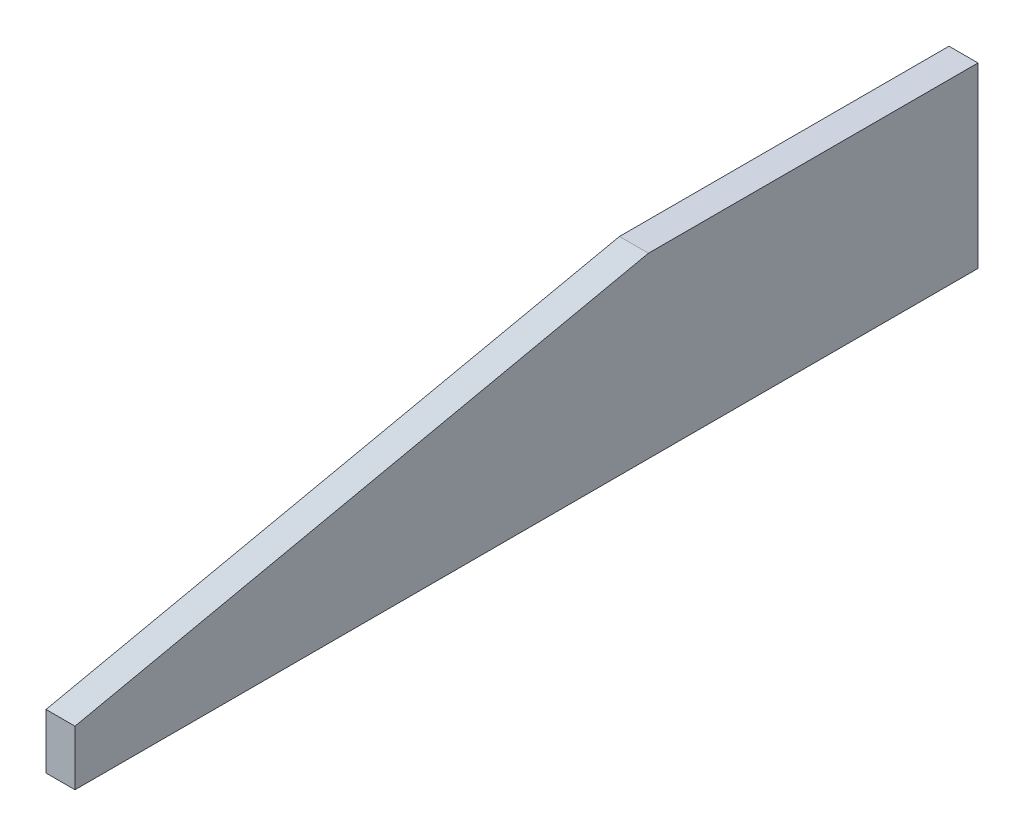
ISO-10303-21;
HEADER;
FILE_DESCRIPTION(('STEP AP214'),'2;1');
FILE_NAME('part.step','',(''),(''),'','','');
FILE_SCHEMA(('AUTOMOTIVE_DESIGN { 1 0 10303 214 1 1 1 1 }'));
ENDSEC;
DATA;
#1=APPLICATION_CONTEXT('core data for automotive mechanical design processes');
#2=APPLICATION_PROTOCOL_DEFINITION('international standard','automotive_design',2000,#1);
#3=PRODUCT_CONTEXT('',#1,'mechanical');
#4=PRODUCT('Part','Part','',(#3));
#5=PRODUCT_RELATED_PRODUCT_CATEGORY('part','',(#4));
#6=PRODUCT_DEFINITION_FORMATION('','',#4);
#7=PRODUCT_DEFINITION_CONTEXT('part definition',#1,'design');
#8=PRODUCT_DEFINITION('design','',#6,#7);
#9=PRODUCT_DEFINITION_SHAPE('','',#8);
#10=(LENGTH_UNIT() NAMED_UNIT(*) SI_UNIT(.MILLI.,.METRE.));
#11=(NAMED_UNIT(*) PLANE_ANGLE_UNIT() SI_UNIT($,.RADIAN.));
#12=(NAMED_UNIT(*) SI_UNIT($,.STERADIAN.) SOLID_ANGLE_UNIT());
#13=UNCERTAINTY_MEASURE_WITH_UNIT(LENGTH_MEASURE(1.E-05),#10,'distance_accuracy_value','');
#14=(GEOMETRIC_REPRESENTATION_CONTEXT(3) GLOBAL_UNCERTAINTY_ASSIGNED_CONTEXT((#13)) GLOBAL_UNIT_ASSIGNED_CONTEXT((#10,
#11,#12)) REPRESENTATION_CONTEXT('',''));
#15=CARTESIAN_POINT('',(0.,0.,0.));
#16=DIRECTION('',(0.,0.,1.));
#17=DIRECTION('',(1.,0.,0.));
#18=AXIS2_PLACEMENT_3D('',#15,#16,#17);
#19=CARTESIAN_POINT('',(-22.01,205.,100.01));
#20=DIRECTION('',(0.,1.,0.));
#21=DIRECTION('',(1.,0.,0.));
#22=AXIS2_PLACEMENT_3D('',#19,#20,#21);
#23=PLANE('',#22);
#24=DIRECTION('',(0.,0.,1.));
#25=VECTOR('',#24,1.);
#26=CARTESIAN_POINT('',(0.,205.,192.5));
#27=LINE('',#26,#25);
#28=CARTESIAN_POINT('',(0.,205.,-150.));
#29=VERTEX_POINT('',#28);
#30=CARTESIAN_POINT('',(0.,205.,100.));
#31=VERTEX_POINT('',#30);
#32=EDGE_CURVE('E61',#29,#31,#27,.T.);
#33=ORIENTED_EDGE('',*,*,#32,.F.);
#34=DIRECTION('',(1.,0.,0.));
#35=VECTOR('',#34,1.);
#36=CARTESIAN_POINT('',(-11.,205.,-150.));
#37=LINE('',#36,#35);
#38=CARTESIAN_POINT('',(-22.,205.,-150.));
#39=VERTEX_POINT('',#38);
#40=EDGE_CURVE('E64',#39,#29,#37,.T.);
#41=ORIENTED_EDGE('',*,*,#40,.F.);
#42=DIRECTION('',(0.,0.,-1.));
#43=VECTOR('',#42,1.);
#44=CARTESIAN_POINT('',(-22.,205.,192.5));
#45=LINE('',#44,#43);
#46=CARTESIAN_POINT('',(-22.,205.,99.9999999999995));
#47=VERTEX_POINT('',#46);
#48=EDGE_CURVE('E95',#47,#39,#45,.T.);
#49=ORIENTED_EDGE('',*,*,#48,.F.);
#50=DIRECTION('',(-1.,0.,0.));
#51=VECTOR('',#50,1.);
#52=CARTESIAN_POINT('',(-11.,205.,99.9999999999999));
#53=LINE('',#52,#51);
#54=EDGE_CURVE('E67',#31,#47,#53,.T.);
#55=ORIENTED_EDGE('',*,*,#54,.F.);
#56=EDGE_LOOP('',(#33,#41,#49,#55));
#57=FACE_BOUND('',#56,.T.);
#58=ADVANCED_FACE('F17',(#57),#23,.T.);
#59=CARTESIAN_POINT('',(0.01,69.9899999999998,-150.));
#60=DIRECTION('',(0.,0.,-1.));
#61=DIRECTION('',(-1.,0.,0.));
#62=AXIS2_PLACEMENT_3D('',#59,#60,#61);
#63=PLANE('',#62);
#64=DIRECTION('',(0.,-1.,0.));
#65=VECTOR('',#64,1.);
#66=CARTESIAN_POINT('',(-22.,137.5,-150.));
#67=LINE('',#66,#65);
#68=CARTESIAN_POINT('',(-22.,69.9999999999998,-150.));
#69=VERTEX_POINT('',#68);
#70=EDGE_CURVE('E77',#39,#69,#67,.T.);
#71=ORIENTED_EDGE('',*,*,#70,.F.);
#72=ORIENTED_EDGE('',*,*,#40,.T.);
#73=DIRECTION('',(0.,1.,0.));
#74=VECTOR('',#73,1.);
#75=CARTESIAN_POINT('',(0.,137.5,-150.));
#76=LINE('',#75,#74);
#77=CARTESIAN_POINT('',(0.,69.9999999999999,-150.));
#78=VERTEX_POINT('',#77);
#79=EDGE_CURVE('E71',#78,#29,#76,.T.);
#80=ORIENTED_EDGE('',*,*,#79,.F.);
#81=DIRECTION('',(1.,0.,0.));
#82=VECTOR('',#81,1.);
#83=CARTESIAN_POINT('',(-11.,69.9999999999998,-150.));
#84=LINE('',#83,#82);
#85=EDGE_CURVE('E103',#69,#78,#84,.T.);
#86=ORIENTED_EDGE('',*,*,#85,.F.);
#87=EDGE_LOOP('',(#71,#72,#80,#86));
#88=FACE_BOUND('',#87,.T.);
#89=ADVANCED_FACE('F74',(#88),#63,.T.);
#90=CARTESIAN_POINT('',(0.,205.01,535.01));
#91=DIRECTION('',(1.,0.,0.));
#92=DIRECTION('',(0.,-1.,0.));
#93=AXIS2_PLACEMENT_3D('',#90,#91,#92);
#94=PLANE('',#93);
#95=DIRECTION('',(0.,0.,1.));
#96=VECTOR('',#95,1.);
#97=CARTESIAN_POINT('',(0.,69.9999999999998,192.5));
#98=LINE('',#97,#96);
#99=CARTESIAN_POINT('',(0.,69.9999999999999,535.));
#100=VERTEX_POINT('',#99);
#101=EDGE_CURVE('E82',#78,#100,#98,.T.);
#102=ORIENTED_EDGE('',*,*,#101,.F.);
#103=ORIENTED_EDGE('',*,*,#79,.T.);
#104=ORIENTED_EDGE('',*,*,#32,.T.);
#105=DIRECTION('',(0.,0.209529088730872,-0.97780241407741));
#106=VECTOR('',#105,1.);
#107=CARTESIAN_POINT('',(0.,158.392857142857,317.5));
#108=LINE('',#107,#106);
#109=CARTESIAN_POINT('',(0.,111.785714285714,535.));
#110=VERTEX_POINT('',#109);
#111=EDGE_CURVE('E84',#110,#31,#108,.T.);
#112=ORIENTED_EDGE('',*,*,#111,.F.);
#113=DIRECTION('',(0.,1.,0.));
#114=VECTOR('',#113,1.);
#115=CARTESIAN_POINT('',(0.,90.892857142857,535.));
#116=LINE('',#115,#114);
#117=EDGE_CURVE('E94',#100,#110,#116,.T.);
#118=ORIENTED_EDGE('',*,*,#117,.F.);
#119=EDGE_LOOP('',(#102,#103,#104,#112,#118));
#120=FACE_BOUND('',#119,.T.);
#121=ADVANCED_FACE('F80',(#120),#94,.T.);
#122=CARTESIAN_POINT('',(0.01,111.783618994827,535.009778024141));
#123=DIRECTION('',(0.,0.97780241407741,0.209529088730872));
#124=DIRECTION('',(0.,0.209529088730872,-0.97780241407741));
#125=AXIS2_PLACEMENT_3D('',#122,#123,#124);
#126=PLANE('',#125);
#127=DIRECTION('',(0.,0.209529088730874,-0.977802414077409));
#128=VECTOR('',#127,1.);
#129=CARTESIAN_POINT('',(-22.,111.785714285714,535.));
#130=LINE('',#129,#128);
#131=CARTESIAN_POINT('',(-22.,111.785714285714,535.));
#132=VERTEX_POINT('',#131);
#133=EDGE_CURVE('E21',#132,#47,#130,.T.);
#134=ORIENTED_EDGE('',*,*,#133,.F.);
#135=DIRECTION('',(-1.,0.,0.));
#136=VECTOR('',#135,1.);
#137=CARTESIAN_POINT('',(-11.,111.785714285714,535.));
#138=LINE('',#137,#136);
#139=EDGE_CURVE('E91',#110,#132,#138,.T.);
#140=ORIENTED_EDGE('',*,*,#139,.F.);
#141=ORIENTED_EDGE('',*,*,#111,.T.);
#142=ORIENTED_EDGE('',*,*,#54,.T.);
#143=EDGE_LOOP('',(#134,#140,#141,#142));
#144=FACE_BOUND('',#143,.T.);
#145=ADVANCED_FACE('F100',(#144),#126,.T.);
#146=CARTESIAN_POINT('',(-22.,69.9899999999998,535.01));
#147=DIRECTION('',(-1.,0.,0.));
#148=DIRECTION('',(0.,1.,0.));
#149=AXIS2_PLACEMENT_3D('',#146,#147,#148);
#150=PLANE('',#149);
#151=ORIENTED_EDGE('',*,*,#48,.T.);
#152=ORIENTED_EDGE('',*,*,#70,.T.);
#153=DIRECTION('',(0.,0.,-1.));
#154=VECTOR('',#153,1.);
#155=CARTESIAN_POINT('',(-22.,69.9999999999998,192.5));
#156=LINE('',#155,#154);
#157=CARTESIAN_POINT('',(-22.,69.9999999999998,535.));
#158=VERTEX_POINT('',#157);
#159=EDGE_CURVE('E36',#158,#69,#156,.T.);
#160=ORIENTED_EDGE('',*,*,#159,.F.);
#161=DIRECTION('',(0.,-1.,0.));
#162=VECTOR('',#161,1.);
#163=CARTESIAN_POINT('',(-22.,90.892857142857,535.));
#164=LINE('',#163,#162);
#165=EDGE_CURVE('E27',#132,#158,#164,.T.);
#166=ORIENTED_EDGE('',*,*,#165,.F.);
#167=ORIENTED_EDGE('',*,*,#133,.T.);
#168=EDGE_LOOP('',(#151,#152,#160,#166,#167));
#169=FACE_BOUND('',#168,.T.);
#170=ADVANCED_FACE('F97',(#169),#150,.T.);
#171=CARTESIAN_POINT('',(0.00999999999999891,69.9999999999998,535.01));
#172=DIRECTION('',(0.,-1.,0.));
#173=DIRECTION('',(-1.,0.,0.));
#174=AXIS2_PLACEMENT_3D('',#171,#172,#173);
#175=PLANE('',#174);
#176=ORIENTED_EDGE('',*,*,#159,.T.);
#177=ORIENTED_EDGE('',*,*,#85,.T.);
#178=ORIENTED_EDGE('',*,*,#101,.T.);
#179=DIRECTION('',(1.,0.,0.));
#180=VECTOR('',#179,1.);
#181=CARTESIAN_POINT('',(-11.,69.9999999999999,535.));
#182=LINE('',#181,#180);
#183=EDGE_CURVE('E11',#158,#100,#182,.T.);
#184=ORIENTED_EDGE('',*,*,#183,.F.);
#185=EDGE_LOOP('',(#176,#177,#178,#184));
#186=FACE_BOUND('',#185,.T.);
#187=ADVANCED_FACE('F106',(#186),#175,.T.);
#188=CARTESIAN_POINT('',(0.01,69.9899999999999,535.));
#189=DIRECTION('',(0.,0.,1.));
#190=DIRECTION('',(0.,1.,0.));
#191=AXIS2_PLACEMENT_3D('',#188,#189,#190);
#192=PLANE('',#191);
#193=ORIENTED_EDGE('',*,*,#165,.T.);
#194=ORIENTED_EDGE('',*,*,#183,.T.);
#195=ORIENTED_EDGE('',*,*,#117,.T.);
#196=ORIENTED_EDGE('',*,*,#139,.T.);
#197=EDGE_LOOP('',(#193,#194,#195,#196));
#198=FACE_BOUND('',#197,.T.);
#199=ADVANCED_FACE('F19',(#198),#192,.T.);
#200=CLOSED_SHELL('',(#58,#89,#121,#145,#170,#187,#199));
#201=MANIFOLD_SOLID_BREP('B1',#200);
#202=ADVANCED_BREP_SHAPE_REPRESENTATION('',(#18,#201),#14);
#203=SHAPE_DEFINITION_REPRESENTATION(#9,#202);
ENDSEC;
END-ISO-10303-21;
